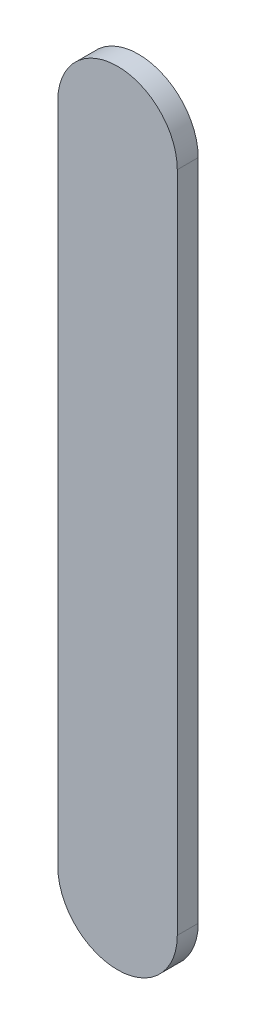
ISO-10303-21;
HEADER;
FILE_DESCRIPTION(('STEP AP214'),'2;1');
FILE_NAME('part.step','',(''),(''),'','','');
FILE_SCHEMA(('AUTOMOTIVE_DESIGN { 1 0 10303 214 1 1 1 1 }'));
ENDSEC;
DATA;
#1=APPLICATION_CONTEXT('core data for automotive mechanical design processes');
#2=APPLICATION_PROTOCOL_DEFINITION('international standard','automotive_design',2000,#1);
#3=PRODUCT_CONTEXT('',#1,'mechanical');
#4=PRODUCT('Part','Part','',(#3));
#5=PRODUCT_RELATED_PRODUCT_CATEGORY('part','',(#4));
#6=PRODUCT_DEFINITION_FORMATION('','',#4);
#7=PRODUCT_DEFINITION_CONTEXT('part definition',#1,'design');
#8=PRODUCT_DEFINITION('design','',#6,#7);
#9=PRODUCT_DEFINITION_SHAPE('','',#8);
#10=(LENGTH_UNIT() NAMED_UNIT(*) SI_UNIT(.MILLI.,.METRE.));
#11=(NAMED_UNIT(*) PLANE_ANGLE_UNIT() SI_UNIT($,.RADIAN.));
#12=(NAMED_UNIT(*) SI_UNIT($,.STERADIAN.) SOLID_ANGLE_UNIT());
#13=UNCERTAINTY_MEASURE_WITH_UNIT(LENGTH_MEASURE(1.E-05),#10,'distance_accuracy_value','');
#14=(GEOMETRIC_REPRESENTATION_CONTEXT(3) GLOBAL_UNCERTAINTY_ASSIGNED_CONTEXT((#13)) GLOBAL_UNIT_ASSIGNED_CONTEXT((#10,
#11,#12)) REPRESENTATION_CONTEXT('',''));
#15=CARTESIAN_POINT('',(0.,0.,0.));
#16=DIRECTION('',(0.,0.,1.));
#17=DIRECTION('',(1.,0.,0.));
#18=AXIS2_PLACEMENT_3D('',#15,#16,#17);
#19=CARTESIAN_POINT('',(81.81,-132.44,1.635));
#20=DIRECTION('',(0.,0.,1.));
#21=DIRECTION('',(1.,0.,0.));
#22=AXIS2_PLACEMENT_3D('',#19,#20,#21);
#23=PLANE('',#22);
#24=DIRECTION('',(0.,1.,0.));
#25=VECTOR('',#24,1.);
#26=CARTESIAN_POINT('',(81.81,-132.44,1.635));
#27=LINE('',#26,#25);
#28=CARTESIAN_POINT('',(81.81,-132.44,1.635));
#29=VERTEX_POINT('',#28);
#30=CARTESIAN_POINT('',(81.81,-131.33,1.635));
#31=VERTEX_POINT('',#30);
#32=EDGE_CURVE('E85',#29,#31,#27,.T.);
#33=ORIENTED_EDGE('',*,*,#32,.T.);
#34=CARTESIAN_POINT('',(81.71,-131.33,1.635));
#35=DIRECTION('',(0.,0.,1.));
#36=DIRECTION('',(1.,-2.84217094304E-13,0.));
#37=AXIS2_PLACEMENT_3D('',#34,#35,#36);
#38=CIRCLE('',#37,0.1);
#39=CARTESIAN_POINT('',(81.61,-131.33,1.635));
#40=VERTEX_POINT('',#39);
#41=EDGE_CURVE('E71',#31,#40,#38,.T.);
#42=ORIENTED_EDGE('',*,*,#41,.T.);
#43=DIRECTION('',(0.,-1.,0.));
#44=VECTOR('',#43,1.);
#45=CARTESIAN_POINT('',(81.61,-131.33,1.635));
#46=LINE('',#45,#44);
#47=CARTESIAN_POINT('',(81.61,-132.44,1.635));
#48=VERTEX_POINT('',#47);
#49=EDGE_CURVE('E109',#40,#48,#46,.T.);
#50=ORIENTED_EDGE('',*,*,#49,.T.);
#51=CARTESIAN_POINT('',(81.71,-132.44,1.635));
#52=DIRECTION('',(0.,0.,1.));
#53=DIRECTION('',(-1.,0.,0.));
#54=AXIS2_PLACEMENT_3D('',#51,#52,#53);
#55=CIRCLE('',#54,0.1);
#56=EDGE_CURVE('E11',#48,#29,#55,.T.);
#57=ORIENTED_EDGE('',*,*,#56,.T.);
#58=EDGE_LOOP('',(#33,#42,#50,#57));
#59=FACE_BOUND('',#58,.T.);
#60=ADVANCED_FACE('F17',(#59),#23,.T.);
#61=CARTESIAN_POINT('',(81.81,-132.44,1.6));
#62=DIRECTION('',(0.,0.,1.));
#63=DIRECTION('',(1.,0.,0.));
#64=AXIS2_PLACEMENT_3D('',#61,#62,#63);
#65=PLANE('',#64);
#66=CARTESIAN_POINT('',(81.71,-132.44,1.6));
#67=DIRECTION('',(0.,0.,1.));
#68=DIRECTION('',(-1.,0.,0.));
#69=AXIS2_PLACEMENT_3D('',#66,#67,#68);
#70=CIRCLE('',#69,0.1);
#71=CARTESIAN_POINT('',(81.61,-132.44,1.6));
#72=VERTEX_POINT('',#71);
#73=CARTESIAN_POINT('',(81.81,-132.44,1.6));
#74=VERTEX_POINT('',#73);
#75=EDGE_CURVE('E26',#72,#74,#70,.T.);
#76=ORIENTED_EDGE('',*,*,#75,.F.);
#77=DIRECTION('',(0.,-1.,0.));
#78=VECTOR('',#77,1.);
#79=CARTESIAN_POINT('',(81.61,-131.33,1.6));
#80=LINE('',#79,#78);
#81=CARTESIAN_POINT('',(81.61,-131.33,1.6));
#82=VERTEX_POINT('',#81);
#83=EDGE_CURVE('E82',#82,#72,#80,.T.);
#84=ORIENTED_EDGE('',*,*,#83,.F.);
#85=CARTESIAN_POINT('',(81.71,-131.33,1.6));
#86=DIRECTION('',(0.,0.,1.));
#87=DIRECTION('',(1.,-2.84217094304E-13,0.));
#88=AXIS2_PLACEMENT_3D('',#85,#86,#87);
#89=CIRCLE('',#88,0.1);
#90=CARTESIAN_POINT('',(81.81,-131.33,1.6));
#91=VERTEX_POINT('',#90);
#92=EDGE_CURVE('E104',#91,#82,#89,.T.);
#93=ORIENTED_EDGE('',*,*,#92,.F.);
#94=DIRECTION('',(0.,1.,0.));
#95=VECTOR('',#94,1.);
#96=CARTESIAN_POINT('',(81.81,-132.44,1.6));
#97=LINE('',#96,#95);
#98=EDGE_CURVE('E92',#74,#91,#97,.T.);
#99=ORIENTED_EDGE('',*,*,#98,.F.);
#100=EDGE_LOOP('',(#76,#84,#93,#99));
#101=FACE_BOUND('',#100,.T.);
#102=ADVANCED_FACE('F117',(#101),#65,.F.);
#103=CARTESIAN_POINT('',(81.71,-132.44,1.6));
#104=DIRECTION('',(0.,0.,-1.));
#105=DIRECTION('',(-1.,0.,0.));
#106=AXIS2_PLACEMENT_3D('',#103,#104,#105);
#107=CYLINDRICAL_SURFACE('',#106,0.1);
#108=ORIENTED_EDGE('',*,*,#75,.T.);
#109=DIRECTION('',(0.,0.,1.));
#110=VECTOR('',#109,1.);
#111=CARTESIAN_POINT('',(81.81,-132.44,1.6));
#112=LINE('',#111,#110);
#113=EDGE_CURVE('E89',#74,#29,#112,.T.);
#114=ORIENTED_EDGE('',*,*,#113,.T.);
#115=ORIENTED_EDGE('',*,*,#56,.F.);
#116=DIRECTION('',(0.,0.,1.));
#117=VECTOR('',#116,1.);
#118=CARTESIAN_POINT('',(81.61,-132.44,1.6));
#119=LINE('',#118,#117);
#120=EDGE_CURVE('E105',#72,#48,#119,.T.);
#121=ORIENTED_EDGE('',*,*,#120,.F.);
#122=EDGE_LOOP('',(#108,#114,#115,#121));
#123=FACE_BOUND('',#122,.T.);
#124=ADVANCED_FACE('F19',(#123),#107,.T.);
#125=CARTESIAN_POINT('',(81.61,-131.33,1.6));
#126=DIRECTION('',(1.,0.,0.));
#127=DIRECTION('',(0.,1.,0.));
#128=AXIS2_PLACEMENT_3D('',#125,#126,#127);
#129=PLANE('',#128);
#130=ORIENTED_EDGE('',*,*,#83,.T.);
#131=ORIENTED_EDGE('',*,*,#120,.T.);
#132=ORIENTED_EDGE('',*,*,#49,.F.);
#133=DIRECTION('',(0.,0.,1.));
#134=VECTOR('',#133,1.);
#135=CARTESIAN_POINT('',(81.61,-131.33,1.6));
#136=LINE('',#135,#134);
#137=EDGE_CURVE('E79',#82,#40,#136,.T.);
#138=ORIENTED_EDGE('',*,*,#137,.F.);
#139=EDGE_LOOP('',(#130,#131,#132,#138));
#140=FACE_BOUND('',#139,.T.);
#141=ADVANCED_FACE('F116',(#140),#129,.F.);
#142=CARTESIAN_POINT('',(81.71,-131.33,1.6));
#143=DIRECTION('',(0.,0.,-1.));
#144=DIRECTION('',(1.,-2.84217094304E-13,0.));
#145=AXIS2_PLACEMENT_3D('',#142,#143,#144);
#146=CYLINDRICAL_SURFACE('',#145,0.1);
#147=ORIENTED_EDGE('',*,*,#92,.T.);
#148=ORIENTED_EDGE('',*,*,#137,.T.);
#149=ORIENTED_EDGE('',*,*,#41,.F.);
#150=DIRECTION('',(0.,0.,1.));
#151=VECTOR('',#150,1.);
#152=CARTESIAN_POINT('',(81.81,-131.33,1.6));
#153=LINE('',#152,#151);
#154=EDGE_CURVE('E76',#91,#31,#153,.T.);
#155=ORIENTED_EDGE('',*,*,#154,.F.);
#156=EDGE_LOOP('',(#147,#148,#149,#155));
#157=FACE_BOUND('',#156,.T.);
#158=ADVANCED_FACE('F74',(#157),#146,.T.);
#159=CARTESIAN_POINT('',(81.81,-132.44,1.6));
#160=DIRECTION('',(-1.,0.,0.));
#161=DIRECTION('',(0.,0.,1.));
#162=AXIS2_PLACEMENT_3D('',#159,#160,#161);
#163=PLANE('',#162);
#164=ORIENTED_EDGE('',*,*,#98,.T.);
#165=ORIENTED_EDGE('',*,*,#154,.T.);
#166=ORIENTED_EDGE('',*,*,#32,.F.);
#167=ORIENTED_EDGE('',*,*,#113,.F.);
#168=EDGE_LOOP('',(#164,#165,#166,#167));
#169=FACE_BOUND('',#168,.T.);
#170=ADVANCED_FACE('F91',(#169),#163,.F.);
#171=CLOSED_SHELL('',(#60,#102,#124,#141,#158,#170));
#172=MANIFOLD_SOLID_BREP('B1',#171);
#173=ADVANCED_BREP_SHAPE_REPRESENTATION('',(#18,#172),#14);
#174=SHAPE_DEFINITION_REPRESENTATION(#9,#173);
ENDSEC;
END-ISO-10303-21;
